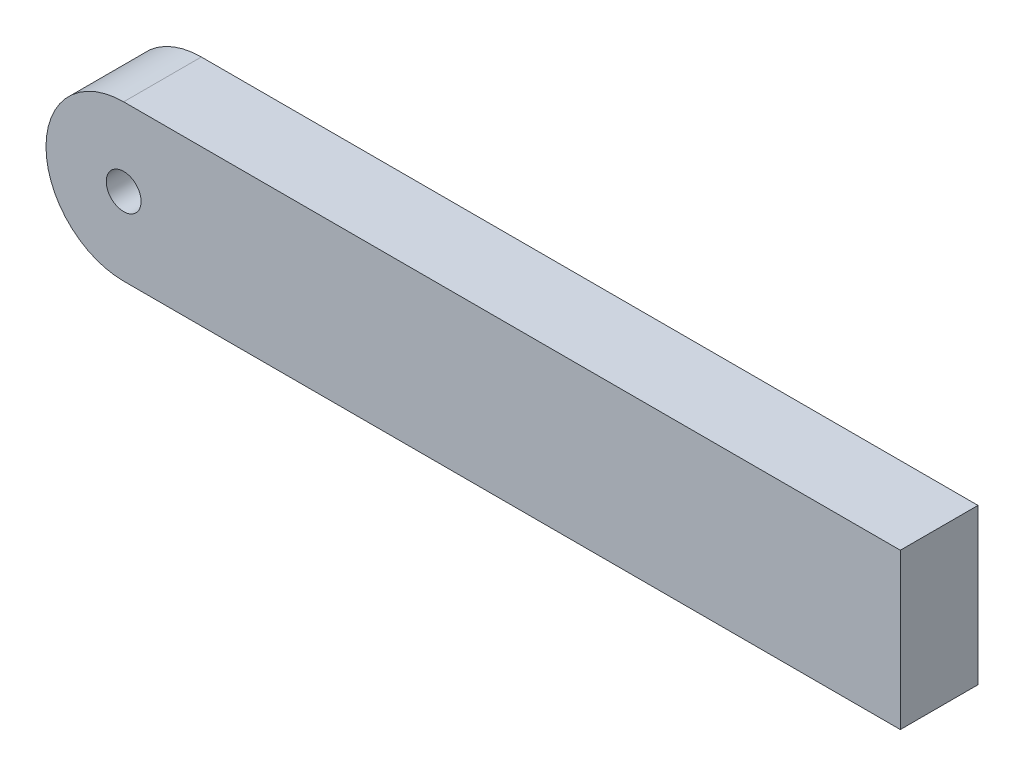
ISO-10303-21;
HEADER;
FILE_DESCRIPTION(('STEP AP214'),'2;1');
FILE_NAME('part.step','',(''),(''),'','','');
FILE_SCHEMA(('AUTOMOTIVE_DESIGN { 1 0 10303 214 1 1 1 1 }'));
ENDSEC;
DATA;
#1=APPLICATION_CONTEXT('core data for automotive mechanical design processes');
#2=APPLICATION_PROTOCOL_DEFINITION('international standard','automotive_design',2000,#1);
#3=PRODUCT_CONTEXT('',#1,'mechanical');
#4=PRODUCT('Part','Part','',(#3));
#5=PRODUCT_RELATED_PRODUCT_CATEGORY('part','',(#4));
#6=PRODUCT_DEFINITION_FORMATION('','',#4);
#7=PRODUCT_DEFINITION_CONTEXT('part definition',#1,'design');
#8=PRODUCT_DEFINITION('design','',#6,#7);
#9=PRODUCT_DEFINITION_SHAPE('','',#8);
#10=(LENGTH_UNIT() NAMED_UNIT(*) SI_UNIT(.MILLI.,.METRE.));
#11=(NAMED_UNIT(*) PLANE_ANGLE_UNIT() SI_UNIT($,.RADIAN.));
#12=(NAMED_UNIT(*) SI_UNIT($,.STERADIAN.) SOLID_ANGLE_UNIT());
#13=UNCERTAINTY_MEASURE_WITH_UNIT(LENGTH_MEASURE(1.E-05),#10,'distance_accuracy_value','');
#14=(GEOMETRIC_REPRESENTATION_CONTEXT(3) GLOBAL_UNCERTAINTY_ASSIGNED_CONTEXT((#13)) GLOBAL_UNIT_ASSIGNED_CONTEXT((#10,
#11,#12)) REPRESENTATION_CONTEXT('',''));
#15=CARTESIAN_POINT('',(0.,0.,0.));
#16=DIRECTION('',(0.,0.,1.));
#17=DIRECTION('',(1.,0.,0.));
#18=AXIS2_PLACEMENT_3D('',#15,#16,#17);
#19=CARTESIAN_POINT('',(7.43849426498855E-12,-1.13505559118376E-10,5.0000000001488));
#20=DIRECTION('',(-1.48420165047014E-12,0.,-1.));
#21=DIRECTION('',(-1.,-1.13478670904499E-12,1.48420165047014E-12));
#22=AXIS2_PLACEMENT_3D('',#19,#20,#21);
#23=CYLINDRICAL_SURFACE('',#22,10.);
#24=CARTESIAN_POINT('',(-7.39686090156511E-12,-1.13505559118376E-10,-4.9999999998512));
#25=DIRECTION('',(1.48420165047014E-12,0.,1.));
#26=DIRECTION('',(1.,1.13478670904499E-12,-1.48420165047014E-12));
#27=AXIS2_PLACEMENT_3D('',#24,#25,#26);
#28=CIRCLE('',#27,10.);
#29=CARTESIAN_POINT('',(3.95516952522712E-12,-10.0000000001135,-4.9999999998512));
#30=VERTEX_POINT('',#29);
#31=CARTESIAN_POINT('',(-1.87488913283573E-11,9.99999999988649,-4.9999999998512));
#32=VERTEX_POINT('',#31);
#33=EDGE_CURVE('E119',#30,#32,#28,.F.);
#34=ORIENTED_EDGE('',*,*,#33,.F.);
#35=DIRECTION('',(-1.48420165047014E-12,0.,-1.));
#36=VECTOR('',#35,1.);
#37=CARTESIAN_POINT('',(1.87905246917808E-11,-10.0000000001135,5.0000000001488));
#38=LINE('',#37,#36);
#39=CARTESIAN_POINT('',(1.87905246917808E-11,-10.0000000001135,5.0000000001488));
#40=VERTEX_POINT('',#39);
#41=EDGE_CURVE('E11',#40,#30,#38,.T.);
#42=ORIENTED_EDGE('',*,*,#41,.F.);
#43=CARTESIAN_POINT('',(7.43849426498855E-12,-1.13505559118376E-10,5.0000000001488));
#44=DIRECTION('',(1.48420165047014E-12,0.,1.));
#45=DIRECTION('',(1.,1.13478670904499E-12,-1.48420165047014E-12));
#46=AXIS2_PLACEMENT_3D('',#43,#44,#45);
#47=CIRCLE('',#46,10.);
#48=CARTESIAN_POINT('',(-3.89965837399586E-12,9.99999999988649,5.0000000001488));
#49=VERTEX_POINT('',#48);
#50=EDGE_CURVE('E105',#40,#49,#47,.F.);
#51=ORIENTED_EDGE('',*,*,#50,.T.);
#52=DIRECTION('',(-1.48420165047014E-12,0.,-1.));
#53=VECTOR('',#52,1.);
#54=CARTESIAN_POINT('',(-3.89965837399586E-12,9.99999999988649,5.0000000001488));
#55=LINE('',#54,#53);
#56=EDGE_CURVE('E82',#49,#32,#55,.T.);
#57=ORIENTED_EDGE('',*,*,#56,.T.);
#58=EDGE_LOOP('',(#34,#42,#51,#57));
#59=FACE_BOUND('',#58,.T.);
#60=ADVANCED_FACE('F41',(#59),#23,.T.);
#61=CARTESIAN_POINT('',(100.000000000018,-10.,5.00000000000038));
#62=DIRECTION('',(1.13478670904499E-12,-1.,0.));
#63=DIRECTION('',(1.,1.13478670904499E-12,-1.48420165047014E-12));
#64=AXIS2_PLACEMENT_3D('',#61,#62,#63);
#65=PLANE('',#64);
#66=DIRECTION('',(-1.,-1.13478670904499E-12,1.48420165047014E-12));
#67=VECTOR('',#66,1.);
#68=CARTESIAN_POINT('',(100.000000000004,-10.,-4.99999999999962));
#69=LINE('',#68,#67);
#70=CARTESIAN_POINT('',(100.000000000004,-10.,-4.99999999999962));
#71=VERTEX_POINT('',#70);
#72=EDGE_CURVE('E94',#71,#30,#69,.T.);
#73=ORIENTED_EDGE('',*,*,#72,.F.);
#74=DIRECTION('',(-1.48420165047014E-12,0.,-1.));
#75=VECTOR('',#74,1.);
#76=CARTESIAN_POINT('',(100.000000000018,-10.,5.00000000000038));
#77=LINE('',#76,#75);
#78=CARTESIAN_POINT('',(100.000000000018,-10.,5.00000000000038));
#79=VERTEX_POINT('',#78);
#80=EDGE_CURVE('E51',#79,#71,#77,.T.);
#81=ORIENTED_EDGE('',*,*,#80,.F.);
#82=DIRECTION('',(-1.,-1.13478670904499E-12,1.48420165047014E-12));
#83=VECTOR('',#82,1.);
#84=CARTESIAN_POINT('',(100.000000000018,-10.,5.00000000000038));
#85=LINE('',#84,#83);
#86=EDGE_CURVE('E92',#79,#40,#85,.T.);
#87=ORIENTED_EDGE('',*,*,#86,.T.);
#88=ORIENTED_EDGE('',*,*,#41,.T.);
#89=EDGE_LOOP('',(#73,#81,#87,#88));
#90=FACE_BOUND('',#89,.T.);
#91=ADVANCED_FACE('F90',(#90),#65,.T.);
#92=CARTESIAN_POINT('',(100.000000000007,0.,5.00000000000038));
#93=DIRECTION('',(-1.,-1.13478670904499E-12,1.48420165047014E-12));
#94=DIRECTION('',(1.13478670904499E-12,-1.,0.));
#95=AXIS2_PLACEMENT_3D('',#92,#93,#94);
#96=PLANE('',#95);
#97=DIRECTION('',(-1.13478670904499E-12,1.,0.));
#98=VECTOR('',#97,1.);
#99=CARTESIAN_POINT('',(99.9999999999922,0.,-4.99999999999962));
#100=LINE('',#99,#98);
#101=CARTESIAN_POINT('',(99.9999999999809,10.,-4.99999999999962));
#102=VERTEX_POINT('',#101);
#103=EDGE_CURVE('E124',#71,#102,#100,.T.);
#104=ORIENTED_EDGE('',*,*,#103,.T.);
#105=DIRECTION('',(-1.48420165047014E-12,0.,-1.));
#106=VECTOR('',#105,1.);
#107=CARTESIAN_POINT('',(99.9999999999957,10.,5.00000000000038));
#108=LINE('',#107,#106);
#109=CARTESIAN_POINT('',(99.9999999999957,10.,5.00000000000038));
#110=VERTEX_POINT('',#109);
#111=EDGE_CURVE('E98',#110,#102,#108,.T.);
#112=ORIENTED_EDGE('',*,*,#111,.F.);
#113=DIRECTION('',(-1.13478670904499E-12,1.,0.));
#114=VECTOR('',#113,1.);
#115=CARTESIAN_POINT('',(100.000000000007,0.,5.00000000000038));
#116=LINE('',#115,#114);
#117=EDGE_CURVE('E100',#79,#110,#116,.T.);
#118=ORIENTED_EDGE('',*,*,#117,.F.);
#119=ORIENTED_EDGE('',*,*,#80,.T.);
#120=EDGE_LOOP('',(#104,#112,#118,#119));
#121=FACE_BOUND('',#120,.T.);
#122=ADVANCED_FACE('F101',(#121),#96,.F.);
#123=CARTESIAN_POINT('',(7.43849426498855E-12,-1.13505559118376E-10,5.0000000001488));
#124=DIRECTION('',(-1.48420165047014E-12,0.,-1.));
#125=DIRECTION('',(-1.,-1.13478670904499E-12,1.48420165047014E-12));
#126=AXIS2_PLACEMENT_3D('',#123,#124,#125);
#127=CYLINDRICAL_SURFACE('',#126,2.24506403026728);
#128=CARTESIAN_POINT('',(7.43849426498855E-12,-1.13505559118376E-10,5.0000000001488));
#129=DIRECTION('',(1.48420165047014E-12,0.,1.));
#130=DIRECTION('',(1.,1.13478670904499E-12,-1.48420165047014E-12));
#131=AXIS2_PLACEMENT_3D('',#128,#129,#130);
#132=CIRCLE('',#131,2.24506403026728);
#133=CARTESIAN_POINT('',(2.24506403027472,-1.10957890295874E-10,5.00000000014547));
#134=VERTEX_POINT('',#133);
#135=EDGE_CURVE('E109',#134,#134,#132,.T.);
#136=ORIENTED_EDGE('',*,*,#135,.T.);
#137=EDGE_LOOP('',(#136));
#138=FACE_BOUND('',#137,.T.);
#139=CARTESIAN_POINT('',(-7.39686090156511E-12,-1.13505559118376E-10,-4.9999999998512));
#140=DIRECTION('',(1.48420165047014E-12,0.,1.));
#141=DIRECTION('',(1.,1.13478670904499E-12,-1.48420165047014E-12));
#142=AXIS2_PLACEMENT_3D('',#139,#140,#141);
#143=CIRCLE('',#142,2.24506403026728);
#144=CARTESIAN_POINT('',(2.24506403025988,-1.10957890295874E-10,-4.99999999985453));
#145=VERTEX_POINT('',#144);
#146=EDGE_CURVE('E115',#145,#145,#143,.T.);
#147=ORIENTED_EDGE('',*,*,#146,.F.);
#148=EDGE_LOOP('',(#147));
#149=FACE_BOUND('',#148,.T.);
#150=ADVANCED_FACE('F43',(#138,#149),#127,.F.);
#151=CARTESIAN_POINT('',(99.9999999999957,10.,5.00000000000038));
#152=DIRECTION('',(1.1351683482097E-12,-1.,0.));
#153=DIRECTION('',(1.,1.1351683482097E-12,-1.48420165047014E-12));
#154=AXIS2_PLACEMENT_3D('',#151,#152,#153);
#155=PLANE('',#154);
#156=DIRECTION('',(-1.,-1.1351683482097E-12,1.48420165047014E-12));
#157=VECTOR('',#156,1.);
#158=CARTESIAN_POINT('',(99.9999999999809,10.,-4.99999999999962));
#159=LINE('',#158,#157);
#160=EDGE_CURVE('E75',#102,#32,#159,.T.);
#161=ORIENTED_EDGE('',*,*,#160,.T.);
#162=ORIENTED_EDGE('',*,*,#56,.F.);
#163=DIRECTION('',(-1.,-1.1351683482097E-12,1.48420165047014E-12));
#164=VECTOR('',#163,1.);
#165=CARTESIAN_POINT('',(99.9999999999957,10.,5.00000000000038));
#166=LINE('',#165,#164);
#167=EDGE_CURVE('E59',#110,#49,#166,.T.);
#168=ORIENTED_EDGE('',*,*,#167,.F.);
#169=ORIENTED_EDGE('',*,*,#111,.T.);
#170=EDGE_LOOP('',(#161,#162,#168,#169));
#171=FACE_BOUND('',#170,.T.);
#172=ADVANCED_FACE('F133',(#171),#155,.F.);
#173=CARTESIAN_POINT('',(100.000000000007,0.,5.00000000000038));
#174=DIRECTION('',(1.48420165047014E-12,0.,1.));
#175=DIRECTION('',(1.,1.13478670904499E-12,-1.48420165047014E-12));
#176=AXIS2_PLACEMENT_3D('',#173,#174,#175);
#177=PLANE('',#176);
#178=ORIENTED_EDGE('',*,*,#135,.F.);
#179=EDGE_LOOP('',(#178));
#180=FACE_BOUND('',#179,.T.);
#181=ORIENTED_EDGE('',*,*,#50,.F.);
#182=ORIENTED_EDGE('',*,*,#86,.F.);
#183=ORIENTED_EDGE('',*,*,#117,.T.);
#184=ORIENTED_EDGE('',*,*,#167,.T.);
#185=EDGE_LOOP('',(#181,#182,#183,#184));
#186=FACE_BOUND('',#185,.T.);
#187=ADVANCED_FACE('F104',(#180,#186),#177,.T.);
#188=CARTESIAN_POINT('',(99.9999999999922,0.,-4.99999999999962));
#189=DIRECTION('',(1.48420165047014E-12,0.,1.));
#190=DIRECTION('',(1.,1.13478670904499E-12,-1.48420165047014E-12));
#191=AXIS2_PLACEMENT_3D('',#188,#189,#190);
#192=PLANE('',#191);
#193=ORIENTED_EDGE('',*,*,#146,.T.);
#194=EDGE_LOOP('',(#193));
#195=FACE_BOUND('',#194,.T.);
#196=ORIENTED_EDGE('',*,*,#33,.T.);
#197=ORIENTED_EDGE('',*,*,#160,.F.);
#198=ORIENTED_EDGE('',*,*,#103,.F.);
#199=ORIENTED_EDGE('',*,*,#72,.T.);
#200=EDGE_LOOP('',(#196,#197,#198,#199));
#201=FACE_BOUND('',#200,.T.);
#202=ADVANCED_FACE('F134',(#195,#201),#192,.F.);
#203=CLOSED_SHELL('',(#60,#91,#122,#150,#172,#187,#202));
#204=MANIFOLD_SOLID_BREP('B2',#203);
#205=ADVANCED_BREP_SHAPE_REPRESENTATION('',(#18,#204),#14);
#206=SHAPE_DEFINITION_REPRESENTATION(#9,#205);
ENDSEC;
END-ISO-10303-21;
